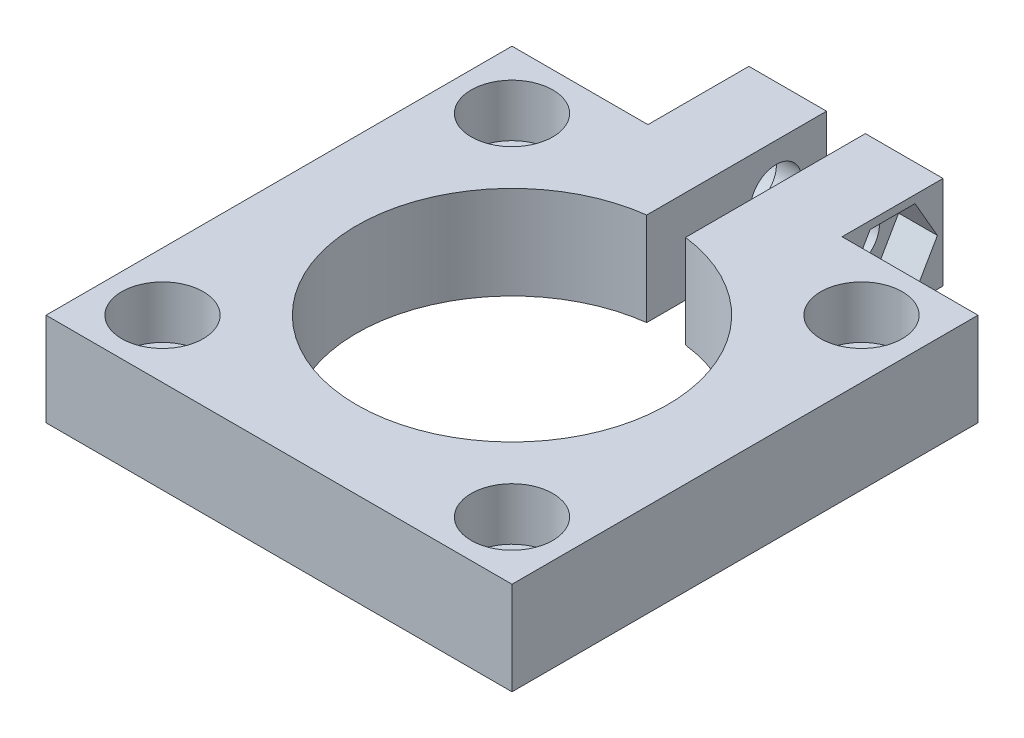
ISO-10303-21;
HEADER;
FILE_DESCRIPTION(('STEP AP214'),'2;1');
FILE_NAME('part.step','',(''),(''),'','','');
FILE_SCHEMA(('AUTOMOTIVE_DESIGN { 1 0 10303 214 1 1 1 1 }'));
ENDSEC;
DATA;
#1=APPLICATION_CONTEXT('core data for automotive mechanical design processes');
#2=APPLICATION_PROTOCOL_DEFINITION('international standard','automotive_design',2000,#1);
#3=PRODUCT_CONTEXT('',#1,'mechanical');
#4=PRODUCT('Part','Part','',(#3));
#5=PRODUCT_RELATED_PRODUCT_CATEGORY('part','',(#4));
#6=PRODUCT_DEFINITION_FORMATION('','',#4);
#7=PRODUCT_DEFINITION_CONTEXT('part definition',#1,'design');
#8=PRODUCT_DEFINITION('design','',#6,#7);
#9=PRODUCT_DEFINITION_SHAPE('','',#8);
#10=(LENGTH_UNIT() NAMED_UNIT(*) SI_UNIT(.MILLI.,.METRE.));
#11=(NAMED_UNIT(*) PLANE_ANGLE_UNIT() SI_UNIT($,.RADIAN.));
#12=(NAMED_UNIT(*) SI_UNIT($,.STERADIAN.) SOLID_ANGLE_UNIT());
#13=UNCERTAINTY_MEASURE_WITH_UNIT(LENGTH_MEASURE(1.E-05),#10,'distance_accuracy_value','');
#14=(GEOMETRIC_REPRESENTATION_CONTEXT(3) GLOBAL_UNCERTAINTY_ASSIGNED_CONTEXT((#13)) GLOBAL_UNIT_ASSIGNED_CONTEXT((#10,
#11,#12)) REPRESENTATION_CONTEXT('',''));
#15=CARTESIAN_POINT('',(0.,0.,0.));
#16=DIRECTION('',(0.,0.,1.));
#17=DIRECTION('',(1.,0.,0.));
#18=AXIS2_PLACEMENT_3D('',#15,#16,#17);
#19=CARTESIAN_POINT('',(-12.5,6.,-36.5));
#20=DIRECTION('',(-1.,0.,0.));
#21=DIRECTION('',(0.,0.,1.));
#22=AXIS2_PLACEMENT_3D('',#19,#20,#21);
#23=CYLINDRICAL_SURFACE('',#22,3.3);
#24=CARTESIAN_POINT('',(2.5,6.,-36.5));
#25=DIRECTION('',(1.,0.,0.));
#26=DIRECTION('',(0.,0.,-1.));
#27=AXIS2_PLACEMENT_3D('',#24,#25,#26);
#28=CIRCLE('',#27,3.3);
#29=CARTESIAN_POINT('',(2.5,6.,-39.8));
#30=VERTEX_POINT('',#29);
#31=EDGE_CURVE('E226',#30,#30,#28,.T.);
#32=ORIENTED_EDGE('',*,*,#31,.F.);
#33=EDGE_LOOP('',(#32));
#34=FACE_BOUND('',#33,.T.);
#35=CARTESIAN_POINT('',(7.50984652470254,6.,-36.5));
#36=DIRECTION('',(1.,0.,0.));
#37=DIRECTION('',(0.,0.,-1.));
#38=AXIS2_PLACEMENT_3D('',#35,#36,#37);
#39=CIRCLE('',#38,3.3);
#40=CARTESIAN_POINT('',(7.50984652470254,6.,-39.8));
#41=VERTEX_POINT('',#40);
#42=EDGE_CURVE('E37',#41,#41,#39,.F.);
#43=ORIENTED_EDGE('',*,*,#42,.F.);
#44=EDGE_LOOP('',(#43));
#45=FACE_BOUND('',#44,.T.);
#46=ADVANCED_FACE('F33',(#34,#45),#23,.F.);
#47=CARTESIAN_POINT('',(-30.,12.,-30.));
#48=DIRECTION('',(0.,0.,1.));
#49=DIRECTION('',(1.,0.,0.));
#50=AXIS2_PLACEMENT_3D('',#47,#48,#49);
#51=PLANE('',#50);
#52=DIRECTION('',(-1.,0.,0.));
#53=VECTOR('',#52,1.);
#54=CARTESIAN_POINT('',(-30.,0.,-30.));
#55=LINE('',#54,#53);
#56=CARTESIAN_POINT('',(30.,0.,-30.));
#57=VERTEX_POINT('',#56);
#58=CARTESIAN_POINT('',(12.5,0.,-30.));
#59=VERTEX_POINT('',#58);
#60=EDGE_CURVE('E301',#57,#59,#55,.T.);
#61=ORIENTED_EDGE('',*,*,#60,.T.);
#62=DIRECTION('',(0.,1.,0.));
#63=VECTOR('',#62,1.);
#64=CARTESIAN_POINT('',(12.5,0.,-30.));
#65=LINE('',#64,#63);
#66=CARTESIAN_POINT('',(12.5,12.,-30.));
#67=VERTEX_POINT('',#66);
#68=EDGE_CURVE('E57',#59,#67,#65,.T.);
#69=ORIENTED_EDGE('',*,*,#68,.T.);
#70=DIRECTION('',(-1.,0.,0.));
#71=VECTOR('',#70,1.);
#72=CARTESIAN_POINT('',(-30.,12.,-30.));
#73=LINE('',#72,#71);
#74=CARTESIAN_POINT('',(30.,12.,-30.));
#75=VERTEX_POINT('',#74);
#76=EDGE_CURVE('E291',#75,#67,#73,.T.);
#77=ORIENTED_EDGE('',*,*,#76,.F.);
#78=DIRECTION('',(0.,-1.,0.));
#79=VECTOR('',#78,1.);
#80=CARTESIAN_POINT('',(30.,12.,-30.));
#81=LINE('',#80,#79);
#82=EDGE_CURVE('E314',#75,#57,#81,.T.);
#83=ORIENTED_EDGE('',*,*,#82,.T.);
#84=EDGE_LOOP('',(#61,#69,#77,#83));
#85=FACE_BOUND('',#84,.T.);
#86=ADVANCED_FACE('F341',(#85),#51,.F.);
#87=CARTESIAN_POINT('',(30.,12.,-30.));
#88=DIRECTION('',(-1.,0.,0.));
#89=DIRECTION('',(0.,0.,1.));
#90=AXIS2_PLACEMENT_3D('',#87,#88,#89);
#91=PLANE('',#90);
#92=DIRECTION('',(0.,0.,-1.));
#93=VECTOR('',#92,1.);
#94=CARTESIAN_POINT('',(30.,0.,-30.));
#95=LINE('',#94,#93);
#96=CARTESIAN_POINT('',(30.,0.,30.));
#97=VERTEX_POINT('',#96);
#98=EDGE_CURVE('E283',#97,#57,#95,.T.);
#99=ORIENTED_EDGE('',*,*,#98,.T.);
#100=ORIENTED_EDGE('',*,*,#82,.F.);
#101=DIRECTION('',(0.,0.,-1.));
#102=VECTOR('',#101,1.);
#103=CARTESIAN_POINT('',(30.,12.,-30.));
#104=LINE('',#103,#102);
#105=CARTESIAN_POINT('',(30.,12.,30.));
#106=VERTEX_POINT('',#105);
#107=EDGE_CURVE('E286',#106,#75,#104,.T.);
#108=ORIENTED_EDGE('',*,*,#107,.F.);
#109=DIRECTION('',(0.,-1.,0.));
#110=VECTOR('',#109,1.);
#111=CARTESIAN_POINT('',(30.,12.,30.));
#112=LINE('',#111,#110);
#113=EDGE_CURVE('E297',#106,#97,#112,.T.);
#114=ORIENTED_EDGE('',*,*,#113,.T.);
#115=EDGE_LOOP('',(#99,#100,#108,#114));
#116=FACE_BOUND('',#115,.T.);
#117=ADVANCED_FACE('F35',(#116),#91,.F.);
#118=CARTESIAN_POINT('',(-12.5,12.,-30.));
#119=VERTEX_POINT('',#118);
#120=CARTESIAN_POINT('',(-30.,12.,-30.));
#121=VERTEX_POINT('',#120);
#122=EDGE_CURVE('E289',#119,#121,#73,.T.);
#123=ORIENTED_EDGE('',*,*,#122,.F.);
#124=DIRECTION('',(0.,1.,0.));
#125=VECTOR('',#124,1.);
#126=CARTESIAN_POINT('',(-12.5,0.,-30.));
#127=LINE('',#126,#125);
#128=CARTESIAN_POINT('',(-12.5,0.,-30.));
#129=VERTEX_POINT('',#128);
#130=EDGE_CURVE('E263',#129,#119,#127,.T.);
#131=ORIENTED_EDGE('',*,*,#130,.F.);
#132=CARTESIAN_POINT('',(-30.,0.,-30.));
#133=VERTEX_POINT('',#132);
#134=EDGE_CURVE('E300',#129,#133,#55,.T.);
#135=ORIENTED_EDGE('',*,*,#134,.T.);
#136=DIRECTION('',(0.,-1.,0.));
#137=VECTOR('',#136,1.);
#138=CARTESIAN_POINT('',(-30.,12.,-30.));
#139=LINE('',#138,#137);
#140=EDGE_CURVE('E311',#121,#133,#139,.T.);
#141=ORIENTED_EDGE('',*,*,#140,.F.);
#142=EDGE_LOOP('',(#123,#131,#135,#141));
#143=FACE_BOUND('',#142,.T.);
#144=ADVANCED_FACE('F357',(#143),#51,.F.);
#145=CARTESIAN_POINT('',(-30.,12.,-30.));
#146=DIRECTION('',(1.,0.,0.));
#147=DIRECTION('',(0.,0.,-1.));
#148=AXIS2_PLACEMENT_3D('',#145,#146,#147);
#149=PLANE('',#148);
#150=DIRECTION('',(0.,0.,1.));
#151=VECTOR('',#150,1.);
#152=CARTESIAN_POINT('',(-30.,0.,-30.));
#153=LINE('',#152,#151);
#154=CARTESIAN_POINT('',(-30.,0.,30.));
#155=VERTEX_POINT('',#154);
#156=EDGE_CURVE('E303',#133,#155,#153,.T.);
#157=ORIENTED_EDGE('',*,*,#156,.T.);
#158=DIRECTION('',(0.,-1.,0.));
#159=VECTOR('',#158,1.);
#160=CARTESIAN_POINT('',(-30.,12.,30.));
#161=LINE('',#160,#159);
#162=CARTESIAN_POINT('',(-30.,12.,30.));
#163=VERTEX_POINT('',#162);
#164=EDGE_CURVE('E308',#163,#155,#161,.T.);
#165=ORIENTED_EDGE('',*,*,#164,.F.);
#166=DIRECTION('',(0.,0.,1.));
#167=VECTOR('',#166,1.);
#168=CARTESIAN_POINT('',(-30.,12.,-30.));
#169=LINE('',#168,#167);
#170=EDGE_CURVE('E293',#121,#163,#169,.T.);
#171=ORIENTED_EDGE('',*,*,#170,.F.);
#172=ORIENTED_EDGE('',*,*,#140,.T.);
#173=EDGE_LOOP('',(#157,#165,#171,#172));
#174=FACE_BOUND('',#173,.T.);
#175=ADVANCED_FACE('F354',(#174),#149,.F.);
#176=CARTESIAN_POINT('',(-30.,12.,30.));
#177=DIRECTION('',(0.,0.,-1.));
#178=DIRECTION('',(-1.,0.,0.));
#179=AXIS2_PLACEMENT_3D('',#176,#177,#178);
#180=PLANE('',#179);
#181=DIRECTION('',(1.,0.,0.));
#182=VECTOR('',#181,1.);
#183=CARTESIAN_POINT('',(-30.,0.,30.));
#184=LINE('',#183,#182);
#185=EDGE_CURVE('E290',#155,#97,#184,.T.);
#186=ORIENTED_EDGE('',*,*,#185,.T.);
#187=ORIENTED_EDGE('',*,*,#113,.F.);
#188=DIRECTION('',(1.,0.,0.));
#189=VECTOR('',#188,1.);
#190=CARTESIAN_POINT('',(-30.,12.,30.));
#191=LINE('',#190,#189);
#192=EDGE_CURVE('E295',#163,#106,#191,.T.);
#193=ORIENTED_EDGE('',*,*,#192,.F.);
#194=ORIENTED_EDGE('',*,*,#164,.T.);
#195=EDGE_LOOP('',(#186,#187,#193,#194));
#196=FACE_BOUND('',#195,.T.);
#197=ADVANCED_FACE('F349',(#196),#180,.F.);
#198=CARTESIAN_POINT('',(30.,12.,30.));
#199=DIRECTION('',(0.,1.,0.));
#200=DIRECTION('',(0.,0.,1.));
#201=AXIS2_PLACEMENT_3D('',#198,#199,#200);
#202=PLANE('',#201);
#203=CARTESIAN_POINT('',(-22.5,12.,22.5));
#204=DIRECTION('',(0.,1.,0.));
#205=DIRECTION('',(0.,0.,1.));
#206=AXIS2_PLACEMENT_3D('',#203,#204,#205);
#207=CIRCLE('',#206,5.24999999999999);
#208=CARTESIAN_POINT('',(-22.5,12.,27.75));
#209=VERTEX_POINT('',#208);
#210=EDGE_CURVE('E511',#209,#209,#207,.T.);
#211=ORIENTED_EDGE('',*,*,#210,.F.);
#212=EDGE_LOOP('',(#211));
#213=FACE_BOUND('',#212,.T.);
#214=CARTESIAN_POINT('',(22.5,12.,22.5));
#215=DIRECTION('',(0.,1.,0.));
#216=DIRECTION('',(0.,0.,1.));
#217=AXIS2_PLACEMENT_3D('',#214,#215,#216);
#218=CIRCLE('',#217,5.24999999999999);
#219=CARTESIAN_POINT('',(22.5,12.,27.75));
#220=VERTEX_POINT('',#219);
#221=EDGE_CURVE('E522',#220,#220,#218,.T.);
#222=ORIENTED_EDGE('',*,*,#221,.F.);
#223=EDGE_LOOP('',(#222));
#224=FACE_BOUND('',#223,.T.);
#225=CARTESIAN_POINT('',(22.5,12.,-22.5));
#226=DIRECTION('',(0.,1.,0.));
#227=DIRECTION('',(0.,0.,1.));
#228=AXIS2_PLACEMENT_3D('',#225,#226,#227);
#229=CIRCLE('',#228,5.24999999999999);
#230=CARTESIAN_POINT('',(22.5,12.,-17.25));
#231=VERTEX_POINT('',#230);
#232=EDGE_CURVE('E534',#231,#231,#229,.T.);
#233=ORIENTED_EDGE('',*,*,#232,.F.);
#234=EDGE_LOOP('',(#233));
#235=FACE_BOUND('',#234,.T.);
#236=CARTESIAN_POINT('',(-22.5,12.,-22.5));
#237=DIRECTION('',(0.,1.,0.));
#238=DIRECTION('',(0.,0.,1.));
#239=AXIS2_PLACEMENT_3D('',#236,#237,#238);
#240=CIRCLE('',#239,5.24999999999999);
#241=CARTESIAN_POINT('',(-22.5,12.,-17.25));
#242=VERTEX_POINT('',#241);
#243=EDGE_CURVE('E546',#242,#242,#240,.T.);
#244=ORIENTED_EDGE('',*,*,#243,.F.);
#245=EDGE_LOOP('',(#244));
#246=FACE_BOUND('',#245,.T.);
#247=DIRECTION('',(0.,0.,-1.));
#248=VECTOR('',#247,1.);
#249=CARTESIAN_POINT('',(2.5,12.,-42.5));
#250=LINE('',#249,#248);
#251=CARTESIAN_POINT('',(2.5,12.,-19.8431348329844));
#252=VERTEX_POINT('',#251);
#253=CARTESIAN_POINT('',(2.5,12.,-43.));
#254=VERTEX_POINT('',#253);
#255=EDGE_CURVE('E266',#252,#254,#250,.T.);
#256=ORIENTED_EDGE('',*,*,#255,.F.);
#257=CARTESIAN_POINT('',(0.,12.,0.));
#258=DIRECTION('',(0.,1.,0.));
#259=DIRECTION('',(0.,0.,1.));
#260=AXIS2_PLACEMENT_3D('',#257,#258,#259);
#261=CIRCLE('',#260,20.);
#262=CARTESIAN_POINT('',(-2.5,12.,-19.8431348329844));
#263=VERTEX_POINT('',#262);
#264=EDGE_CURVE('E277',#263,#252,#261,.T.);
#265=ORIENTED_EDGE('',*,*,#264,.F.);
#266=DIRECTION('',(0.,0.,1.));
#267=VECTOR('',#266,1.);
#268=CARTESIAN_POINT('',(-2.5,12.,-42.5));
#269=LINE('',#268,#267);
#270=CARTESIAN_POINT('',(-2.5,12.,-43.));
#271=VERTEX_POINT('',#270);
#272=EDGE_CURVE('E274',#271,#263,#269,.T.);
#273=ORIENTED_EDGE('',*,*,#272,.F.);
#274=DIRECTION('',(-1.,0.,0.));
#275=VECTOR('',#274,1.);
#276=CARTESIAN_POINT('',(-2.5,12.,-43.));
#277=LINE('',#276,#275);
#278=CARTESIAN_POINT('',(-12.5,12.,-43.));
#279=VERTEX_POINT('',#278);
#280=EDGE_CURVE('E246',#271,#279,#277,.T.);
#281=ORIENTED_EDGE('',*,*,#280,.T.);
#282=DIRECTION('',(0.,0.,1.));
#283=VECTOR('',#282,1.);
#284=CARTESIAN_POINT('',(-12.5,12.,-30.));
#285=LINE('',#284,#283);
#286=EDGE_CURVE('E255',#279,#119,#285,.T.);
#287=ORIENTED_EDGE('',*,*,#286,.T.);
#288=ORIENTED_EDGE('',*,*,#122,.T.);
#289=ORIENTED_EDGE('',*,*,#170,.T.);
#290=ORIENTED_EDGE('',*,*,#192,.T.);
#291=ORIENTED_EDGE('',*,*,#107,.T.);
#292=ORIENTED_EDGE('',*,*,#76,.T.);
#293=DIRECTION('',(0.,0.,-1.));
#294=VECTOR('',#293,1.);
#295=CARTESIAN_POINT('',(12.5,12.,-30.));
#296=LINE('',#295,#294);
#297=CARTESIAN_POINT('',(12.5,12.,-43.));
#298=VERTEX_POINT('',#297);
#299=EDGE_CURVE('E232',#67,#298,#296,.T.);
#300=ORIENTED_EDGE('',*,*,#299,.T.);
#301=DIRECTION('',(-1.,0.,0.));
#302=VECTOR('',#301,1.);
#303=CARTESIAN_POINT('',(12.5,12.,-43.));
#304=LINE('',#303,#302);
#305=EDGE_CURVE('E237',#298,#254,#304,.T.);
#306=ORIENTED_EDGE('',*,*,#305,.T.);
#307=EDGE_LOOP('',(#256,#265,#273,#281,#287,#288,#289,#290,#291,#292,#300,#306));
#308=FACE_BOUND('',#307,.T.);
#309=ADVANCED_FACE('F325',(#213,#224,#235,#246,#308),#202,.T.);
#310=CARTESIAN_POINT('',(30.,0.,30.));
#311=DIRECTION('',(0.,1.,0.));
#312=DIRECTION('',(0.,0.,1.));
#313=AXIS2_PLACEMENT_3D('',#310,#311,#312);
#314=PLANE('',#313);
#315=CARTESIAN_POINT('',(-22.5,-1.81799020282369E-12,22.5));
#316=DIRECTION('',(0.,1.,0.));
#317=DIRECTION('',(0.,0.,1.));
#318=AXIS2_PLACEMENT_3D('',#315,#316,#317);
#319=CIRCLE('',#318,3.75);
#320=CARTESIAN_POINT('',(-22.5,-1.81799020282369E-12,26.25));
#321=VERTEX_POINT('',#320);
#322=EDGE_CURVE('E519',#321,#321,#319,.T.);
#323=ORIENTED_EDGE('',*,*,#322,.T.);
#324=EDGE_LOOP('',(#323));
#325=FACE_BOUND('',#324,.T.);
#326=CARTESIAN_POINT('',(22.5,-1.36349265211777E-12,22.5));
#327=DIRECTION('',(0.,1.,0.));
#328=DIRECTION('',(0.,0.,1.));
#329=AXIS2_PLACEMENT_3D('',#326,#327,#328);
#330=CIRCLE('',#329,3.75);
#331=CARTESIAN_POINT('',(22.5,-1.36349265211777E-12,26.25));
#332=VERTEX_POINT('',#331);
#333=EDGE_CURVE('E531',#332,#332,#330,.T.);
#334=ORIENTED_EDGE('',*,*,#333,.T.);
#335=EDGE_LOOP('',(#334));
#336=FACE_BOUND('',#335,.T.);
#337=CARTESIAN_POINT('',(22.5,-9.08995101411847E-13,-22.5));
#338=DIRECTION('',(0.,1.,0.));
#339=DIRECTION('',(0.,0.,1.));
#340=AXIS2_PLACEMENT_3D('',#337,#338,#339);
#341=CIRCLE('',#340,3.75);
#342=CARTESIAN_POINT('',(22.5,-9.08995101411847E-13,-18.75));
#343=VERTEX_POINT('',#342);
#344=EDGE_CURVE('E543',#343,#343,#341,.T.);
#345=ORIENTED_EDGE('',*,*,#344,.T.);
#346=EDGE_LOOP('',(#345));
#347=FACE_BOUND('',#346,.T.);
#348=CARTESIAN_POINT('',(-22.5,-4.54497550705923E-13,-22.5));
#349=DIRECTION('',(0.,1.,0.));
#350=DIRECTION('',(0.,0.,1.));
#351=AXIS2_PLACEMENT_3D('',#348,#349,#350);
#352=CIRCLE('',#351,3.75);
#353=CARTESIAN_POINT('',(-22.5,-4.54497550705923E-13,-18.75));
#354=VERTEX_POINT('',#353);
#355=EDGE_CURVE('E187',#354,#354,#352,.T.);
#356=ORIENTED_EDGE('',*,*,#355,.T.);
#357=EDGE_LOOP('',(#356));
#358=FACE_BOUND('',#357,.T.);
#359=CARTESIAN_POINT('',(0.,0.,0.));
#360=DIRECTION('',(0.,1.,0.));
#361=DIRECTION('',(0.,0.,1.));
#362=AXIS2_PLACEMENT_3D('',#359,#360,#361);
#363=CIRCLE('',#362,20.);
#364=CARTESIAN_POINT('',(-2.5,0.,-19.8431348329844));
#365=VERTEX_POINT('',#364);
#366=CARTESIAN_POINT('',(2.5,0.,-19.8431348329844));
#367=VERTEX_POINT('',#366);
#368=EDGE_CURVE('E280',#365,#367,#363,.T.);
#369=ORIENTED_EDGE('',*,*,#368,.T.);
#370=DIRECTION('',(0.,0.,-1.));
#371=VECTOR('',#370,1.);
#372=CARTESIAN_POINT('',(2.5,0.,-42.5));
#373=LINE('',#372,#371);
#374=CARTESIAN_POINT('',(2.5,0.,-43.));
#375=VERTEX_POINT('',#374);
#376=EDGE_CURVE('E271',#367,#375,#373,.T.);
#377=ORIENTED_EDGE('',*,*,#376,.T.);
#378=DIRECTION('',(-1.,0.,0.));
#379=VECTOR('',#378,1.);
#380=CARTESIAN_POINT('',(12.5,0.,-43.));
#381=LINE('',#380,#379);
#382=CARTESIAN_POINT('',(12.5,0.,-43.));
#383=VERTEX_POINT('',#382);
#384=EDGE_CURVE('E236',#383,#375,#381,.T.);
#385=ORIENTED_EDGE('',*,*,#384,.F.);
#386=DIRECTION('',(0.,0.,-1.));
#387=VECTOR('',#386,1.);
#388=CARTESIAN_POINT('',(12.5,0.,-30.));
#389=LINE('',#388,#387);
#390=EDGE_CURVE('E233',#59,#383,#389,.T.);
#391=ORIENTED_EDGE('',*,*,#390,.F.);
#392=ORIENTED_EDGE('',*,*,#60,.F.);
#393=ORIENTED_EDGE('',*,*,#98,.F.);
#394=ORIENTED_EDGE('',*,*,#185,.F.);
#395=ORIENTED_EDGE('',*,*,#156,.F.);
#396=ORIENTED_EDGE('',*,*,#134,.F.);
#397=DIRECTION('',(0.,0.,1.));
#398=VECTOR('',#397,1.);
#399=CARTESIAN_POINT('',(-12.5,0.,-30.));
#400=LINE('',#399,#398);
#401=CARTESIAN_POINT('',(-12.5,0.,-43.));
#402=VERTEX_POINT('',#401);
#403=EDGE_CURVE('E254',#402,#129,#400,.T.);
#404=ORIENTED_EDGE('',*,*,#403,.F.);
#405=DIRECTION('',(-1.,0.,0.));
#406=VECTOR('',#405,1.);
#407=CARTESIAN_POINT('',(-2.5,0.,-43.));
#408=LINE('',#407,#406);
#409=CARTESIAN_POINT('',(-2.5,0.,-43.));
#410=VERTEX_POINT('',#409);
#411=EDGE_CURVE('E251',#410,#402,#408,.T.);
#412=ORIENTED_EDGE('',*,*,#411,.F.);
#413=DIRECTION('',(0.,0.,1.));
#414=VECTOR('',#413,1.);
#415=CARTESIAN_POINT('',(-2.5,0.,-42.5));
#416=LINE('',#415,#414);
#417=EDGE_CURVE('E273',#410,#365,#416,.T.);
#418=ORIENTED_EDGE('',*,*,#417,.T.);
#419=EDGE_LOOP('',(#369,#377,#385,#391,#392,#393,#394,#395,#396,#404,#412,#418));
#420=FACE_BOUND('',#419,.T.);
#421=ADVANCED_FACE('F335',(#325,#336,#347,#358,#420),#314,.F.);
#422=CARTESIAN_POINT('',(0.,0.,0.));
#423=DIRECTION('',(0.,1.,0.));
#424=DIRECTION('',(0.,0.,1.));
#425=AXIS2_PLACEMENT_3D('',#422,#423,#424);
#426=CYLINDRICAL_SURFACE('',#425,20.);
#427=ORIENTED_EDGE('',*,*,#264,.T.);
#428=DIRECTION('',(0.,1.,0.));
#429=VECTOR('',#428,1.);
#430=CARTESIAN_POINT('',(2.5,0.,-19.8431348329844));
#431=LINE('',#430,#429);
#432=EDGE_CURVE('E11',#252,#367,#431,.F.);
#433=ORIENTED_EDGE('',*,*,#432,.T.);
#434=ORIENTED_EDGE('',*,*,#368,.F.);
#435=DIRECTION('',(0.,1.,0.));
#436=VECTOR('',#435,1.);
#437=CARTESIAN_POINT('',(-2.5,0.,-19.8431348329844));
#438=LINE('',#437,#436);
#439=EDGE_CURVE('E42',#365,#263,#438,.T.);
#440=ORIENTED_EDGE('',*,*,#439,.T.);
#441=EDGE_LOOP('',(#427,#433,#434,#440));
#442=FACE_BOUND('',#441,.T.);
#443=ADVANCED_FACE('F321',(#442),#426,.F.);
#444=CARTESIAN_POINT('',(-2.5,0.,-42.5));
#445=DIRECTION('',(-1.,0.,0.));
#446=DIRECTION('',(0.,0.,1.));
#447=AXIS2_PLACEMENT_3D('',#444,#445,#446);
#448=PLANE('',#447);
#449=CARTESIAN_POINT('',(-2.5,6.,-36.5));
#450=DIRECTION('',(-1.,0.,0.));
#451=DIRECTION('',(0.,0.,1.));
#452=AXIS2_PLACEMENT_3D('',#449,#450,#451);
#453=CIRCLE('',#452,3.3);
#454=CARTESIAN_POINT('',(-2.5,6.,-33.2));
#455=VERTEX_POINT('',#454);
#456=EDGE_CURVE('E229',#455,#455,#453,.T.);
#457=ORIENTED_EDGE('',*,*,#456,.T.);
#458=EDGE_LOOP('',(#457));
#459=FACE_BOUND('',#458,.T.);
#460=ORIENTED_EDGE('',*,*,#272,.T.);
#461=ORIENTED_EDGE('',*,*,#439,.F.);
#462=ORIENTED_EDGE('',*,*,#417,.F.);
#463=DIRECTION('',(0.,1.,0.));
#464=VECTOR('',#463,1.);
#465=CARTESIAN_POINT('',(-2.5,0.,-43.));
#466=LINE('',#465,#464);
#467=EDGE_CURVE('E258',#410,#271,#466,.T.);
#468=ORIENTED_EDGE('',*,*,#467,.T.);
#469=EDGE_LOOP('',(#460,#461,#462,#468));
#470=FACE_BOUND('',#469,.T.);
#471=ADVANCED_FACE('F367',(#459,#470),#448,.F.);
#472=CARTESIAN_POINT('',(2.5,0.,-42.5));
#473=DIRECTION('',(1.,0.,0.));
#474=DIRECTION('',(0.,0.,-1.));
#475=AXIS2_PLACEMENT_3D('',#472,#473,#474);
#476=PLANE('',#475);
#477=ORIENTED_EDGE('',*,*,#31,.T.);
#478=EDGE_LOOP('',(#477));
#479=FACE_BOUND('',#478,.T.);
#480=ORIENTED_EDGE('',*,*,#376,.F.);
#481=ORIENTED_EDGE('',*,*,#432,.F.);
#482=ORIENTED_EDGE('',*,*,#255,.T.);
#483=DIRECTION('',(0.,1.,0.));
#484=VECTOR('',#483,1.);
#485=CARTESIAN_POINT('',(2.5,0.,-43.));
#486=LINE('',#485,#484);
#487=EDGE_CURVE('E247',#375,#254,#486,.T.);
#488=ORIENTED_EDGE('',*,*,#487,.F.);
#489=EDGE_LOOP('',(#480,#481,#482,#488));
#490=FACE_BOUND('',#489,.T.);
#491=ADVANCED_FACE('F329',(#479,#490),#476,.F.);
#492=CARTESIAN_POINT('',(-12.5,0.,-30.));
#493=DIRECTION('',(-1.,0.,0.));
#494=DIRECTION('',(0.,0.,1.));
#495=AXIS2_PLACEMENT_3D('',#492,#493,#494);
#496=PLANE('',#495);
#497=CARTESIAN_POINT('',(-12.5,6.,-36.5));
#498=DIRECTION('',(-1.,0.,0.));
#499=DIRECTION('',(0.,0.,1.));
#500=AXIS2_PLACEMENT_3D('',#497,#498,#499);
#501=CIRCLE('',#500,5.25);
#502=CARTESIAN_POINT('',(-12.5,6.,-31.25));
#503=VERTEX_POINT('',#502);
#504=EDGE_CURVE('E217',#503,#503,#501,.T.);
#505=ORIENTED_EDGE('',*,*,#504,.F.);
#506=EDGE_LOOP('',(#505));
#507=FACE_BOUND('',#506,.T.);
#508=ORIENTED_EDGE('',*,*,#286,.F.);
#509=DIRECTION('',(0.,1.,0.));
#510=VECTOR('',#509,1.);
#511=CARTESIAN_POINT('',(-12.5,0.,-43.));
#512=LINE('',#511,#510);
#513=EDGE_CURVE('E267',#402,#279,#512,.T.);
#514=ORIENTED_EDGE('',*,*,#513,.F.);
#515=ORIENTED_EDGE('',*,*,#403,.T.);
#516=ORIENTED_EDGE('',*,*,#130,.T.);
#517=EDGE_LOOP('',(#508,#514,#515,#516));
#518=FACE_BOUND('',#517,.T.);
#519=ADVANCED_FACE('F362',(#507,#518),#496,.T.);
#520=CARTESIAN_POINT('',(-2.5,0.,-43.));
#521=DIRECTION('',(0.,0.,-1.));
#522=DIRECTION('',(-1.,0.,0.));
#523=AXIS2_PLACEMENT_3D('',#520,#521,#522);
#524=PLANE('',#523);
#525=ORIENTED_EDGE('',*,*,#280,.F.);
#526=ORIENTED_EDGE('',*,*,#467,.F.);
#527=ORIENTED_EDGE('',*,*,#411,.T.);
#528=ORIENTED_EDGE('',*,*,#513,.T.);
#529=EDGE_LOOP('',(#525,#526,#527,#528));
#530=FACE_BOUND('',#529,.T.);
#531=ADVANCED_FACE('F365',(#530),#524,.T.);
#532=CARTESIAN_POINT('',(12.5,0.,-30.));
#533=DIRECTION('',(1.,0.,0.));
#534=DIRECTION('',(0.,0.,-1.));
#535=AXIS2_PLACEMENT_3D('',#532,#533,#534);
#536=PLANE('',#535);
#537=DIRECTION('',(0.,0.866025403784439,-0.499999999999999));
#538=VECTOR('',#537,1.);
#539=CARTESIAN_POINT('',(12.5,1.,-39.3867513459481));
#540=LINE('',#539,#538);
#541=CARTESIAN_POINT('',(12.5,1.,-39.3867513459481));
#542=VERTEX_POINT('',#541);
#543=CARTESIAN_POINT('',(12.5,6.,-42.2735026918963));
#544=VERTEX_POINT('',#543);
#545=EDGE_CURVE('E49',#542,#544,#540,.T.);
#546=ORIENTED_EDGE('',*,*,#545,.F.);
#547=DIRECTION('',(0.,0.,-1.));
#548=VECTOR('',#547,1.);
#549=CARTESIAN_POINT('',(12.5,1.,-33.6132486540519));
#550=LINE('',#549,#548);
#551=CARTESIAN_POINT('',(12.5,1.,-33.6132486540519));
#552=VERTEX_POINT('',#551);
#553=EDGE_CURVE('E181',#552,#542,#550,.T.);
#554=ORIENTED_EDGE('',*,*,#553,.F.);
#555=DIRECTION('',(0.,-0.866025403784438,-0.5));
#556=VECTOR('',#555,1.);
#557=CARTESIAN_POINT('',(12.5,6.,-30.7264973081037));
#558=LINE('',#557,#556);
#559=CARTESIAN_POINT('',(12.5,6.,-30.7264973081037));
#560=VERTEX_POINT('',#559);
#561=EDGE_CURVE('E184',#560,#552,#558,.T.);
#562=ORIENTED_EDGE('',*,*,#561,.F.);
#563=DIRECTION('',(0.,-0.866025403784439,0.5));
#564=VECTOR('',#563,1.);
#565=CARTESIAN_POINT('',(12.5,11.,-33.6132486540519));
#566=LINE('',#565,#564);
#567=CARTESIAN_POINT('',(12.5,11.,-33.6132486540519));
#568=VERTEX_POINT('',#567);
#569=EDGE_CURVE('E203',#568,#560,#566,.T.);
#570=ORIENTED_EDGE('',*,*,#569,.F.);
#571=DIRECTION('',(0.,0.,1.));
#572=VECTOR('',#571,1.);
#573=CARTESIAN_POINT('',(12.5,11.,-39.3867513459481));
#574=LINE('',#573,#572);
#575=CARTESIAN_POINT('',(12.5,11.,-39.3867513459481));
#576=VERTEX_POINT('',#575);
#577=EDGE_CURVE('E200',#576,#568,#574,.T.);
#578=ORIENTED_EDGE('',*,*,#577,.F.);
#579=DIRECTION('',(0.,0.866025403784439,0.5));
#580=VECTOR('',#579,1.);
#581=CARTESIAN_POINT('',(12.5,6.,-42.2735026918963));
#582=LINE('',#581,#580);
#583=EDGE_CURVE('E198',#544,#576,#582,.T.);
#584=ORIENTED_EDGE('',*,*,#583,.F.);
#585=EDGE_LOOP('',(#546,#554,#562,#570,#578,#584));
#586=FACE_BOUND('',#585,.T.);
#587=ORIENTED_EDGE('',*,*,#299,.F.);
#588=ORIENTED_EDGE('',*,*,#68,.F.);
#589=ORIENTED_EDGE('',*,*,#390,.T.);
#590=DIRECTION('',(0.,1.,0.));
#591=VECTOR('',#590,1.);
#592=CARTESIAN_POINT('',(12.5,0.,-43.));
#593=LINE('',#592,#591);
#594=EDGE_CURVE('E240',#383,#298,#593,.T.);
#595=ORIENTED_EDGE('',*,*,#594,.T.);
#596=EDGE_LOOP('',(#587,#588,#589,#595));
#597=FACE_BOUND('',#596,.T.);
#598=ADVANCED_FACE('F338',(#586,#597),#536,.T.);
#599=CARTESIAN_POINT('',(12.5,0.,-43.));
#600=DIRECTION('',(0.,0.,-1.));
#601=DIRECTION('',(-1.,0.,0.));
#602=AXIS2_PLACEMENT_3D('',#599,#600,#601);
#603=PLANE('',#602);
#604=ORIENTED_EDGE('',*,*,#305,.F.);
#605=ORIENTED_EDGE('',*,*,#594,.F.);
#606=ORIENTED_EDGE('',*,*,#384,.T.);
#607=ORIENTED_EDGE('',*,*,#487,.T.);
#608=EDGE_LOOP('',(#604,#605,#606,#607));
#609=FACE_BOUND('',#608,.T.);
#610=ADVANCED_FACE('F331',(#609),#603,.T.);
#611=CARTESIAN_POINT('',(-5.75,6.,-36.5));
#612=DIRECTION('',(-1.,0.,0.));
#613=DIRECTION('',(0.,0.,1.));
#614=AXIS2_PLACEMENT_3D('',#611,#612,#613);
#615=CIRCLE('',#614,3.3);
#616=CARTESIAN_POINT('',(-5.75,6.,-33.2));
#617=VERTEX_POINT('',#616);
#618=EDGE_CURVE('E223',#617,#617,#615,.T.);
#619=ORIENTED_EDGE('',*,*,#618,.T.);
#620=EDGE_LOOP('',(#619));
#621=FACE_BOUND('',#620,.T.);
#622=ORIENTED_EDGE('',*,*,#456,.F.);
#623=EDGE_LOOP('',(#622));
#624=FACE_BOUND('',#623,.T.);
#625=ADVANCED_FACE('F382',(#621,#624),#23,.F.);
#626=CARTESIAN_POINT('',(-5.75,9.3,-36.5));
#627=DIRECTION('',(1.,0.,0.));
#628=DIRECTION('',(0.,0.,-1.));
#629=AXIS2_PLACEMENT_3D('',#626,#627,#628);
#630=PLANE('',#629);
#631=ORIENTED_EDGE('',*,*,#618,.F.);
#632=EDGE_LOOP('',(#631));
#633=FACE_BOUND('',#632,.T.);
#634=CARTESIAN_POINT('',(-5.75,6.,-36.5));
#635=DIRECTION('',(-1.,0.,0.));
#636=DIRECTION('',(0.,0.,1.));
#637=AXIS2_PLACEMENT_3D('',#634,#635,#636);
#638=CIRCLE('',#637,5.25);
#639=CARTESIAN_POINT('',(-5.75,6.,-31.25));
#640=VERTEX_POINT('',#639);
#641=EDGE_CURVE('E220',#640,#640,#638,.T.);
#642=ORIENTED_EDGE('',*,*,#641,.T.);
#643=EDGE_LOOP('',(#642));
#644=FACE_BOUND('',#643,.T.);
#645=ADVANCED_FACE('F391',(#633,#644),#630,.F.);
#646=CARTESIAN_POINT('',(-12.5,6.,-36.5));
#647=DIRECTION('',(-1.,0.,0.));
#648=DIRECTION('',(0.,0.,1.));
#649=AXIS2_PLACEMENT_3D('',#646,#647,#648);
#650=CYLINDRICAL_SURFACE('',#649,5.25);
#651=ORIENTED_EDGE('',*,*,#641,.F.);
#652=EDGE_LOOP('',(#651));
#653=FACE_BOUND('',#652,.T.);
#654=ORIENTED_EDGE('',*,*,#504,.T.);
#655=EDGE_LOOP('',(#654));
#656=FACE_BOUND('',#655,.T.);
#657=ADVANCED_FACE('F397',(#653,#656),#650,.F.);
#658=CARTESIAN_POINT('',(7.50984652470254,6.,-42.2735026918963));
#659=DIRECTION('',(1.,0.,0.));
#660=DIRECTION('',(0.,0.,-1.));
#661=AXIS2_PLACEMENT_3D('',#658,#659,#660);
#662=PLANE('',#661);
#663=DIRECTION('',(0.,0.866025403784439,-0.499999999999999));
#664=VECTOR('',#663,1.);
#665=CARTESIAN_POINT('',(7.50984652470254,1.,-39.3867513459481));
#666=LINE('',#665,#664);
#667=CARTESIAN_POINT('',(7.50984652470254,1.,-39.3867513459481));
#668=VERTEX_POINT('',#667);
#669=CARTESIAN_POINT('',(7.50984652470254,6.,-42.2735026918963));
#670=VERTEX_POINT('',#669);
#671=EDGE_CURVE('E161',#668,#670,#666,.T.);
#672=ORIENTED_EDGE('',*,*,#671,.T.);
#673=DIRECTION('',(0.,0.866025403784439,0.5));
#674=VECTOR('',#673,1.);
#675=CARTESIAN_POINT('',(7.50984652470254,6.,-42.2735026918963));
#676=LINE('',#675,#674);
#677=CARTESIAN_POINT('',(7.50984652470254,11.,-39.3867513459481));
#678=VERTEX_POINT('',#677);
#679=EDGE_CURVE('E170',#670,#678,#676,.T.);
#680=ORIENTED_EDGE('',*,*,#679,.T.);
#681=DIRECTION('',(0.,0.,1.));
#682=VECTOR('',#681,1.);
#683=CARTESIAN_POINT('',(7.50984652470254,11.,-39.3867513459481));
#684=LINE('',#683,#682);
#685=CARTESIAN_POINT('',(7.50984652470254,11.,-33.6132486540519));
#686=VERTEX_POINT('',#685);
#687=EDGE_CURVE('E175',#678,#686,#684,.T.);
#688=ORIENTED_EDGE('',*,*,#687,.T.);
#689=DIRECTION('',(0.,-0.866025403784439,0.5));
#690=VECTOR('',#689,1.);
#691=CARTESIAN_POINT('',(7.50984652470254,11.,-33.6132486540519));
#692=LINE('',#691,#690);
#693=CARTESIAN_POINT('',(7.50984652470254,6.,-30.7264973081037));
#694=VERTEX_POINT('',#693);
#695=EDGE_CURVE('E191',#686,#694,#692,.T.);
#696=ORIENTED_EDGE('',*,*,#695,.T.);
#697=DIRECTION('',(0.,-0.866025403784438,-0.5));
#698=VECTOR('',#697,1.);
#699=CARTESIAN_POINT('',(7.50984652470254,6.,-30.7264973081037));
#700=LINE('',#699,#698);
#701=CARTESIAN_POINT('',(7.50984652470254,1.,-33.6132486540519));
#702=VERTEX_POINT('',#701);
#703=EDGE_CURVE('E194',#694,#702,#700,.T.);
#704=ORIENTED_EDGE('',*,*,#703,.T.);
#705=DIRECTION('',(0.,0.,-1.));
#706=VECTOR('',#705,1.);
#707=CARTESIAN_POINT('',(7.50984652470254,1.,-33.6132486540519));
#708=LINE('',#707,#706);
#709=EDGE_CURVE('E167',#702,#668,#708,.T.);
#710=ORIENTED_EDGE('',*,*,#709,.T.);
#711=EDGE_LOOP('',(#672,#680,#688,#696,#704,#710));
#712=FACE_BOUND('',#711,.T.);
#713=ORIENTED_EDGE('',*,*,#42,.T.);
#714=EDGE_LOOP('',(#713));
#715=FACE_BOUND('',#714,.T.);
#716=ADVANCED_FACE('F177',(#712,#715),#662,.T.);
#717=CARTESIAN_POINT('',(7.50984652470254,1.,-39.3867513459481));
#718=DIRECTION('',(0.,-0.499999999999999,-0.866025403784439));
#719=DIRECTION('',(0.,0.866025403784439,-0.499999999999999));
#720=AXIS2_PLACEMENT_3D('',#717,#718,#719);
#721=PLANE('',#720);
#722=ORIENTED_EDGE('',*,*,#545,.T.);
#723=DIRECTION('',(1.,0.,0.));
#724=VECTOR('',#723,1.);
#725=CARTESIAN_POINT('',(7.50984652470254,6.,-42.2735026918963));
#726=LINE('',#725,#724);
#727=EDGE_CURVE('E157',#670,#544,#726,.T.);
#728=ORIENTED_EDGE('',*,*,#727,.F.);
#729=ORIENTED_EDGE('',*,*,#671,.F.);
#730=DIRECTION('',(1.,0.,0.));
#731=VECTOR('',#730,1.);
#732=CARTESIAN_POINT('',(7.50984652470254,1.,-39.3867513459481));
#733=LINE('',#732,#731);
#734=EDGE_CURVE('E208',#668,#542,#733,.T.);
#735=ORIENTED_EDGE('',*,*,#734,.T.);
#736=EDGE_LOOP('',(#722,#728,#729,#735));
#737=FACE_BOUND('',#736,.T.);
#738=ADVANCED_FACE('F159',(#737),#721,.F.);
#739=CARTESIAN_POINT('',(7.50984652470254,1.,-33.6132486540519));
#740=DIRECTION('',(0.,-1.,0.));
#741=DIRECTION('',(0.,0.,-1.));
#742=AXIS2_PLACEMENT_3D('',#739,#740,#741);
#743=PLANE('',#742);
#744=ORIENTED_EDGE('',*,*,#553,.T.);
#745=ORIENTED_EDGE('',*,*,#734,.F.);
#746=ORIENTED_EDGE('',*,*,#709,.F.);
#747=DIRECTION('',(1.,0.,0.));
#748=VECTOR('',#747,1.);
#749=CARTESIAN_POINT('',(7.50984652470254,1.,-33.6132486540519));
#750=LINE('',#749,#748);
#751=EDGE_CURVE('E210',#702,#552,#750,.T.);
#752=ORIENTED_EDGE('',*,*,#751,.T.);
#753=EDGE_LOOP('',(#744,#745,#746,#752));
#754=FACE_BOUND('',#753,.T.);
#755=ADVANCED_FACE('F433',(#754),#743,.F.);
#756=CARTESIAN_POINT('',(7.50984652470254,6.,-30.7264973081037));
#757=DIRECTION('',(0.,-0.5,0.866025403784439));
#758=DIRECTION('',(0.,-0.866025403784439,-0.5));
#759=AXIS2_PLACEMENT_3D('',#756,#757,#758);
#760=PLANE('',#759);
#761=ORIENTED_EDGE('',*,*,#561,.T.);
#762=ORIENTED_EDGE('',*,*,#751,.F.);
#763=ORIENTED_EDGE('',*,*,#703,.F.);
#764=DIRECTION('',(1.,0.,0.));
#765=VECTOR('',#764,1.);
#766=CARTESIAN_POINT('',(7.50984652470254,6.,-30.7264973081037));
#767=LINE('',#766,#765);
#768=EDGE_CURVE('E212',#694,#560,#767,.T.);
#769=ORIENTED_EDGE('',*,*,#768,.T.);
#770=EDGE_LOOP('',(#761,#762,#763,#769));
#771=FACE_BOUND('',#770,.T.);
#772=ADVANCED_FACE('F431',(#771),#760,.F.);
#773=CARTESIAN_POINT('',(7.50984652470254,11.,-33.6132486540519));
#774=DIRECTION('',(0.,0.5,0.866025403784439));
#775=DIRECTION('',(0.,-0.866025403784439,0.5));
#776=AXIS2_PLACEMENT_3D('',#773,#774,#775);
#777=PLANE('',#776);
#778=ORIENTED_EDGE('',*,*,#569,.T.);
#779=ORIENTED_EDGE('',*,*,#768,.F.);
#780=ORIENTED_EDGE('',*,*,#695,.F.);
#781=DIRECTION('',(1.,0.,0.));
#782=VECTOR('',#781,1.);
#783=CARTESIAN_POINT('',(7.50984652470254,11.,-33.6132486540519));
#784=LINE('',#783,#782);
#785=EDGE_CURVE('E214',#686,#568,#784,.T.);
#786=ORIENTED_EDGE('',*,*,#785,.T.);
#787=EDGE_LOOP('',(#778,#779,#780,#786));
#788=FACE_BOUND('',#787,.T.);
#789=ADVANCED_FACE('F429',(#788),#777,.F.);
#790=CARTESIAN_POINT('',(7.50984652470254,11.,-39.3867513459481));
#791=DIRECTION('',(0.,1.,0.));
#792=DIRECTION('',(0.,0.,1.));
#793=AXIS2_PLACEMENT_3D('',#790,#791,#792);
#794=PLANE('',#793);
#795=ORIENTED_EDGE('',*,*,#577,.T.);
#796=ORIENTED_EDGE('',*,*,#785,.F.);
#797=ORIENTED_EDGE('',*,*,#687,.F.);
#798=DIRECTION('',(1.,0.,0.));
#799=VECTOR('',#798,1.);
#800=CARTESIAN_POINT('',(7.50984652470254,11.,-39.3867513459481));
#801=LINE('',#800,#799);
#802=EDGE_CURVE('E166',#678,#576,#801,.T.);
#803=ORIENTED_EDGE('',*,*,#802,.T.);
#804=EDGE_LOOP('',(#795,#796,#797,#803));
#805=FACE_BOUND('',#804,.T.);
#806=ADVANCED_FACE('F425',(#805),#794,.F.);
#807=CARTESIAN_POINT('',(7.50984652470254,6.,-42.2735026918963));
#808=DIRECTION('',(0.,0.5,-0.866025403784439));
#809=DIRECTION('',(0.,0.866025403784439,0.5));
#810=AXIS2_PLACEMENT_3D('',#807,#808,#809);
#811=PLANE('',#810);
#812=ORIENTED_EDGE('',*,*,#583,.T.);
#813=ORIENTED_EDGE('',*,*,#802,.F.);
#814=ORIENTED_EDGE('',*,*,#679,.F.);
#815=ORIENTED_EDGE('',*,*,#727,.T.);
#816=EDGE_LOOP('',(#812,#813,#814,#815));
#817=FACE_BOUND('',#816,.T.);
#818=ADVANCED_FACE('F171',(#817),#811,.F.);
#819=CARTESIAN_POINT('',(-22.5,12.,-22.5));
#820=DIRECTION('',(0.,1.,0.));
#821=DIRECTION('',(0.,0.,1.));
#822=AXIS2_PLACEMENT_3D('',#819,#820,#821);
#823=CYLINDRICAL_SURFACE('',#822,3.75);
#824=ORIENTED_EDGE('',*,*,#355,.F.);
#825=EDGE_LOOP('',(#824));
#826=FACE_BOUND('',#825,.T.);
#827=CARTESIAN_POINT('',(-22.5,5.25,-22.5));
#828=DIRECTION('',(0.,1.,0.));
#829=DIRECTION('',(0.,0.,1.));
#830=AXIS2_PLACEMENT_3D('',#827,#828,#829);
#831=CIRCLE('',#830,3.75);
#832=CARTESIAN_POINT('',(-22.5,5.25,-18.75));
#833=VERTEX_POINT('',#832);
#834=EDGE_CURVE('E551',#833,#833,#831,.T.);
#835=ORIENTED_EDGE('',*,*,#834,.T.);
#836=EDGE_LOOP('',(#835));
#837=FACE_BOUND('',#836,.T.);
#838=ADVANCED_FACE('F450',(#826,#837),#823,.F.);
#839=CARTESIAN_POINT('',(-18.75,5.25,-22.5));
#840=DIRECTION('',(0.,-1.,0.));
#841=DIRECTION('',(0.,0.,-1.));
#842=AXIS2_PLACEMENT_3D('',#839,#840,#841);
#843=PLANE('',#842);
#844=ORIENTED_EDGE('',*,*,#834,.F.);
#845=EDGE_LOOP('',(#844));
#846=FACE_BOUND('',#845,.T.);
#847=CARTESIAN_POINT('',(-22.5,5.25,-22.5));
#848=DIRECTION('',(0.,1.,0.));
#849=DIRECTION('',(0.,0.,1.));
#850=AXIS2_PLACEMENT_3D('',#847,#848,#849);
#851=CIRCLE('',#850,5.24999999999999);
#852=CARTESIAN_POINT('',(-22.5,5.25,-17.25));
#853=VERTEX_POINT('',#852);
#854=EDGE_CURVE('E549',#853,#853,#851,.T.);
#855=ORIENTED_EDGE('',*,*,#854,.T.);
#856=EDGE_LOOP('',(#855));
#857=FACE_BOUND('',#856,.T.);
#858=ADVANCED_FACE('F454',(#846,#857),#843,.F.);
#859=CARTESIAN_POINT('',(-22.5,12.,-22.5));
#860=DIRECTION('',(0.,1.,0.));
#861=DIRECTION('',(0.,0.,1.));
#862=AXIS2_PLACEMENT_3D('',#859,#860,#861);
#863=CYLINDRICAL_SURFACE('',#862,5.24999999999999);
#864=ORIENTED_EDGE('',*,*,#854,.F.);
#865=EDGE_LOOP('',(#864));
#866=FACE_BOUND('',#865,.T.);
#867=ORIENTED_EDGE('',*,*,#243,.T.);
#868=EDGE_LOOP('',(#867));
#869=FACE_BOUND('',#868,.T.);
#870=ADVANCED_FACE('F459',(#866,#869),#863,.F.);
#871=CARTESIAN_POINT('',(22.5,12.,-22.5));
#872=DIRECTION('',(0.,1.,0.));
#873=DIRECTION('',(0.,0.,1.));
#874=AXIS2_PLACEMENT_3D('',#871,#872,#873);
#875=CYLINDRICAL_SURFACE('',#874,3.75000000000001);
#876=ORIENTED_EDGE('',*,*,#344,.F.);
#877=EDGE_LOOP('',(#876));
#878=FACE_BOUND('',#877,.T.);
#879=CARTESIAN_POINT('',(22.5,5.25,-22.5));
#880=DIRECTION('',(0.,1.,0.));
#881=DIRECTION('',(0.,0.,1.));
#882=AXIS2_PLACEMENT_3D('',#879,#880,#881);
#883=CIRCLE('',#882,3.75000000000001);
#884=CARTESIAN_POINT('',(22.5,5.25,-18.75));
#885=VERTEX_POINT('',#884);
#886=EDGE_CURVE('E540',#885,#885,#883,.T.);
#887=ORIENTED_EDGE('',*,*,#886,.T.);
#888=EDGE_LOOP('',(#887));
#889=FACE_BOUND('',#888,.T.);
#890=ADVANCED_FACE('F467',(#878,#889),#875,.F.);
#891=CARTESIAN_POINT('',(26.25,5.25,-22.5));
#892=DIRECTION('',(0.,-1.,0.));
#893=DIRECTION('',(0.,0.,-1.));
#894=AXIS2_PLACEMENT_3D('',#891,#892,#893);
#895=PLANE('',#894);
#896=ORIENTED_EDGE('',*,*,#886,.F.);
#897=EDGE_LOOP('',(#896));
#898=FACE_BOUND('',#897,.T.);
#899=CARTESIAN_POINT('',(22.5,5.25,-22.5));
#900=DIRECTION('',(0.,1.,0.));
#901=DIRECTION('',(0.,0.,1.));
#902=AXIS2_PLACEMENT_3D('',#899,#900,#901);
#903=CIRCLE('',#902,5.24999999999999);
#904=CARTESIAN_POINT('',(22.5,5.25,-17.25));
#905=VERTEX_POINT('',#904);
#906=EDGE_CURVE('E537',#905,#905,#903,.T.);
#907=ORIENTED_EDGE('',*,*,#906,.T.);
#908=EDGE_LOOP('',(#907));
#909=FACE_BOUND('',#908,.T.);
#910=ADVANCED_FACE('F471',(#898,#909),#895,.F.);
#911=CARTESIAN_POINT('',(22.5,12.,-22.5));
#912=DIRECTION('',(0.,1.,0.));
#913=DIRECTION('',(0.,0.,1.));
#914=AXIS2_PLACEMENT_3D('',#911,#912,#913);
#915=CYLINDRICAL_SURFACE('',#914,5.24999999999999);
#916=ORIENTED_EDGE('',*,*,#906,.F.);
#917=EDGE_LOOP('',(#916));
#918=FACE_BOUND('',#917,.T.);
#919=ORIENTED_EDGE('',*,*,#232,.T.);
#920=EDGE_LOOP('',(#919));
#921=FACE_BOUND('',#920,.T.);
#922=ADVANCED_FACE('F475',(#918,#921),#915,.F.);
#923=CARTESIAN_POINT('',(22.5,12.,22.5));
#924=DIRECTION('',(0.,1.,0.));
#925=DIRECTION('',(0.,0.,1.));
#926=AXIS2_PLACEMENT_3D('',#923,#924,#925);
#927=CYLINDRICAL_SURFACE('',#926,3.75000000000001);
#928=ORIENTED_EDGE('',*,*,#333,.F.);
#929=EDGE_LOOP('',(#928));
#930=FACE_BOUND('',#929,.T.);
#931=CARTESIAN_POINT('',(22.5,5.25,22.5));
#932=DIRECTION('',(0.,1.,0.));
#933=DIRECTION('',(0.,0.,1.));
#934=AXIS2_PLACEMENT_3D('',#931,#932,#933);
#935=CIRCLE('',#934,3.75000000000001);
#936=CARTESIAN_POINT('',(22.5,5.25,26.25));
#937=VERTEX_POINT('',#936);
#938=EDGE_CURVE('E528',#937,#937,#935,.T.);
#939=ORIENTED_EDGE('',*,*,#938,.T.);
#940=EDGE_LOOP('',(#939));
#941=FACE_BOUND('',#940,.T.);
#942=ADVANCED_FACE('F479',(#930,#941),#927,.F.);
#943=CARTESIAN_POINT('',(26.25,5.25,22.5));
#944=DIRECTION('',(0.,-1.,0.));
#945=DIRECTION('',(0.,0.,-1.));
#946=AXIS2_PLACEMENT_3D('',#943,#944,#945);
#947=PLANE('',#946);
#948=ORIENTED_EDGE('',*,*,#938,.F.);
#949=EDGE_LOOP('',(#948));
#950=FACE_BOUND('',#949,.T.);
#951=CARTESIAN_POINT('',(22.5,5.25,22.5));
#952=DIRECTION('',(0.,1.,0.));
#953=DIRECTION('',(0.,0.,1.));
#954=AXIS2_PLACEMENT_3D('',#951,#952,#953);
#955=CIRCLE('',#954,5.24999999999999);
#956=CARTESIAN_POINT('',(22.5,5.25,27.75));
#957=VERTEX_POINT('',#956);
#958=EDGE_CURVE('E525',#957,#957,#955,.T.);
#959=ORIENTED_EDGE('',*,*,#958,.T.);
#960=EDGE_LOOP('',(#959));
#961=FACE_BOUND('',#960,.T.);
#962=ADVANCED_FACE('F483',(#950,#961),#947,.F.);
#963=CARTESIAN_POINT('',(22.5,12.,22.5));
#964=DIRECTION('',(0.,1.,0.));
#965=DIRECTION('',(0.,0.,1.));
#966=AXIS2_PLACEMENT_3D('',#963,#964,#965);
#967=CYLINDRICAL_SURFACE('',#966,5.24999999999999);
#968=ORIENTED_EDGE('',*,*,#958,.F.);
#969=EDGE_LOOP('',(#968));
#970=FACE_BOUND('',#969,.T.);
#971=ORIENTED_EDGE('',*,*,#221,.T.);
#972=EDGE_LOOP('',(#971));
#973=FACE_BOUND('',#972,.T.);
#974=ADVANCED_FACE('F487',(#970,#973),#967,.F.);
#975=CARTESIAN_POINT('',(-22.5,12.,22.5));
#976=DIRECTION('',(0.,1.,0.));
#977=DIRECTION('',(0.,0.,1.));
#978=AXIS2_PLACEMENT_3D('',#975,#976,#977);
#979=CYLINDRICAL_SURFACE('',#978,3.75000000000001);
#980=ORIENTED_EDGE('',*,*,#322,.F.);
#981=EDGE_LOOP('',(#980));
#982=FACE_BOUND('',#981,.T.);
#983=CARTESIAN_POINT('',(-22.5,5.25,22.5));
#984=DIRECTION('',(0.,1.,0.));
#985=DIRECTION('',(0.,0.,1.));
#986=AXIS2_PLACEMENT_3D('',#983,#984,#985);
#987=CIRCLE('',#986,3.75000000000001);
#988=CARTESIAN_POINT('',(-22.5,5.25,26.25));
#989=VERTEX_POINT('',#988);
#990=EDGE_CURVE('E514',#989,#989,#987,.T.);
#991=ORIENTED_EDGE('',*,*,#990,.T.);
#992=EDGE_LOOP('',(#991));
#993=FACE_BOUND('',#992,.T.);
#994=ADVANCED_FACE('F491',(#982,#993),#979,.F.);
#995=CARTESIAN_POINT('',(-18.75,5.25,22.5));
#996=DIRECTION('',(0.,-1.,0.));
#997=DIRECTION('',(0.,0.,-1.));
#998=AXIS2_PLACEMENT_3D('',#995,#996,#997);
#999=PLANE('',#998);
#1000=ORIENTED_EDGE('',*,*,#990,.F.);
#1001=EDGE_LOOP('',(#1000));
#1002=FACE_BOUND('',#1001,.T.);
#1003=CARTESIAN_POINT('',(-22.5,5.25,22.5));
#1004=DIRECTION('',(0.,1.,0.));
#1005=DIRECTION('',(0.,0.,1.));
#1006=AXIS2_PLACEMENT_3D('',#1003,#1004,#1005);
#1007=CIRCLE('',#1006,5.24999999999999);
#1008=CARTESIAN_POINT('',(-22.5,5.25,27.75));
#1009=VERTEX_POINT('',#1008);
#1010=EDGE_CURVE('E508',#1009,#1009,#1007,.T.);
#1011=ORIENTED_EDGE('',*,*,#1010,.T.);
#1012=EDGE_LOOP('',(#1011));
#1013=FACE_BOUND('',#1012,.T.);
#1014=ADVANCED_FACE('F495',(#1002,#1013),#999,.F.);
#1015=CARTESIAN_POINT('',(-22.5,12.,22.5));
#1016=DIRECTION('',(0.,1.,0.));
#1017=DIRECTION('',(0.,0.,1.));
#1018=AXIS2_PLACEMENT_3D('',#1015,#1016,#1017);
#1019=CYLINDRICAL_SURFACE('',#1018,5.24999999999999);
#1020=ORIENTED_EDGE('',*,*,#1010,.F.);
#1021=EDGE_LOOP('',(#1020));
#1022=FACE_BOUND('',#1021,.T.);
#1023=ORIENTED_EDGE('',*,*,#210,.T.);
#1024=EDGE_LOOP('',(#1023));
#1025=FACE_BOUND('',#1024,.T.);
#1026=ADVANCED_FACE('F499',(#1022,#1025),#1019,.F.);
#1027=CLOSED_SHELL('',(#46,#86,#117,#144,#175,#197,#309,#421,#443,#471,#491,#519,#531,#598,#610,
#625,#645,#657,#716,#738,#755,#772,#789,#806,#818,#838,#858,#870,#890,#910,#922,#942,#962,#974,
#994,#1014,#1026));
#1028=MANIFOLD_SOLID_BREP('B2',#1027);
#1029=ADVANCED_BREP_SHAPE_REPRESENTATION('',(#18,#1028),#14);
#1030=SHAPE_DEFINITION_REPRESENTATION(#9,#1029);
ENDSEC;
END-ISO-10303-21;
